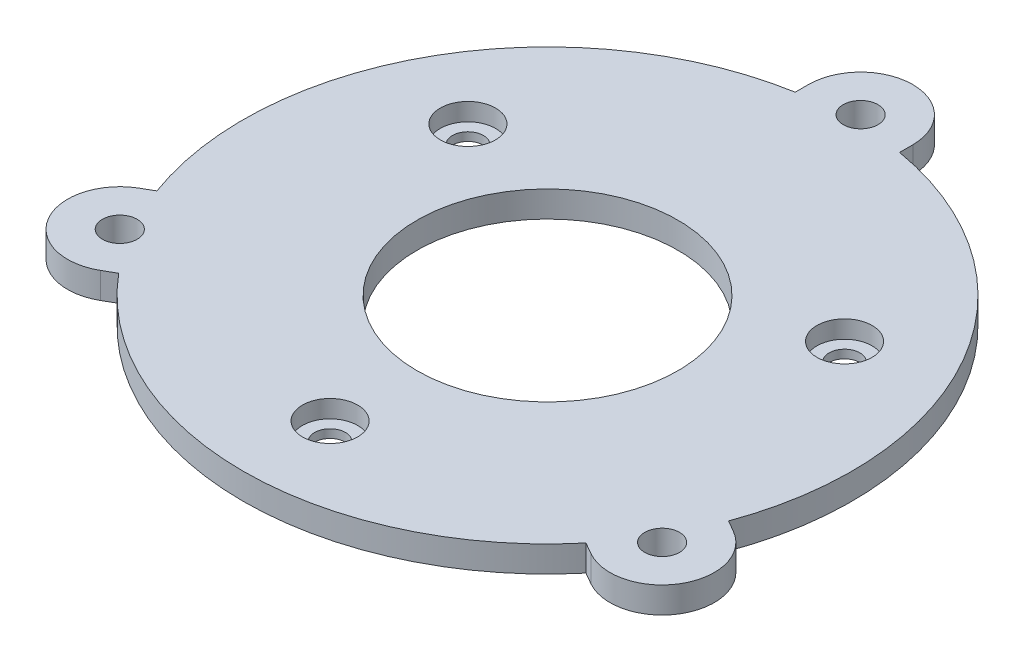
ISO-10303-21;
HEADER;
FILE_DESCRIPTION(('STEP AP214'),'2;1');
FILE_NAME('part.step','',(''),(''),'','','');
FILE_SCHEMA(('AUTOMOTIVE_DESIGN { 1 0 10303 214 1 1 1 1 }'));
ENDSEC;
DATA;
#1=APPLICATION_CONTEXT('core data for automotive mechanical design processes');
#2=APPLICATION_PROTOCOL_DEFINITION('international standard','automotive_design',2000,#1);
#3=PRODUCT_CONTEXT('',#1,'mechanical');
#4=PRODUCT('Part','Part','',(#3));
#5=PRODUCT_RELATED_PRODUCT_CATEGORY('part','',(#4));
#6=PRODUCT_DEFINITION_FORMATION('','',#4);
#7=PRODUCT_DEFINITION_CONTEXT('part definition',#1,'design');
#8=PRODUCT_DEFINITION('design','',#6,#7);
#9=PRODUCT_DEFINITION_SHAPE('','',#8);
#10=(LENGTH_UNIT() NAMED_UNIT(*) SI_UNIT(.MILLI.,.METRE.));
#11=(NAMED_UNIT(*) PLANE_ANGLE_UNIT() SI_UNIT($,.RADIAN.));
#12=(NAMED_UNIT(*) SI_UNIT($,.STERADIAN.) SOLID_ANGLE_UNIT());
#13=UNCERTAINTY_MEASURE_WITH_UNIT(LENGTH_MEASURE(1.E-05),#10,'distance_accuracy_value','');
#14=(GEOMETRIC_REPRESENTATION_CONTEXT(3) GLOBAL_UNCERTAINTY_ASSIGNED_CONTEXT((#13)) GLOBAL_UNIT_ASSIGNED_CONTEXT((#10,
#11,#12)) REPRESENTATION_CONTEXT('',''));
#15=CARTESIAN_POINT('',(0.,0.,0.));
#16=DIRECTION('',(0.,0.,1.));
#17=DIRECTION('',(1.,0.,0.));
#18=AXIS2_PLACEMENT_3D('',#15,#16,#17);
#19=CARTESIAN_POINT('',(1.50000000000001,1.5,-2.59807621135331));
#20=DIRECTION('',(0.500000000000004,0.,-0.866025403784436));
#21=DIRECTION('',(-0.866025403784436,0.,-0.500000000000004));
#22=AXIS2_PLACEMENT_3D('',#19,#20,#21);
#23=PLANE('',#22);
#24=DIRECTION('',(0.866025403784436,0.,0.500000000000004));
#25=VECTOR('',#24,1.);
#26=CARTESIAN_POINT('',(1.50000000000001,0.,-2.59807621135331));
#27=LINE('',#26,#25);
#28=CARTESIAN_POINT('',(16.4310917216391,0.,6.0223936134301));
#29=VERTEX_POINT('',#28);
#30=CARTESIAN_POINT('',(17.0884572681199,0.,6.40192378864676));
#31=VERTEX_POINT('',#30);
#32=EDGE_CURVE('E164',#29,#31,#27,.T.);
#33=ORIENTED_EDGE('',*,*,#32,.F.);
#34=DIRECTION('',(0.,-1.,0.));
#35=VECTOR('',#34,1.);
#36=CARTESIAN_POINT('',(16.4310917216391,1.5,6.0223936134301));
#37=LINE('',#36,#35);
#38=CARTESIAN_POINT('',(16.4310917216391,1.5,6.0223936134301));
#39=VERTEX_POINT('',#38);
#40=EDGE_CURVE('E11',#39,#29,#37,.T.);
#41=ORIENTED_EDGE('',*,*,#40,.F.);
#42=DIRECTION('',(0.866025403784436,0.,0.500000000000004));
#43=VECTOR('',#42,1.);
#44=CARTESIAN_POINT('',(1.50000000000001,1.5,-2.59807621135331));
#45=LINE('',#44,#43);
#46=CARTESIAN_POINT('',(17.0884572681199,1.5,6.40192378864676));
#47=VERTEX_POINT('',#46);
#48=EDGE_CURVE('E204',#39,#47,#45,.T.);
#49=ORIENTED_EDGE('',*,*,#48,.T.);
#50=DIRECTION('',(0.,-1.,0.));
#51=VECTOR('',#50,1.);
#52=CARTESIAN_POINT('',(17.0884572681199,1.5,6.40192378864676));
#53=LINE('',#52,#51);
#54=EDGE_CURVE('E98',#47,#31,#53,.T.);
#55=ORIENTED_EDGE('',*,*,#54,.T.);
#56=EDGE_LOOP('',(#33,#41,#49,#55));
#57=FACE_BOUND('',#56,.T.);
#58=ADVANCED_FACE('F35',(#57),#23,.T.);
#59=CARTESIAN_POINT('',(0.,1.5,0.));
#60=DIRECTION('',(0.,-1.,0.));
#61=DIRECTION('',(0.,0.,-1.));
#62=AXIS2_PLACEMENT_3D('',#59,#60,#61);
#63=CYLINDRICAL_SURFACE('',#62,17.5);
#64=CARTESIAN_POINT('',(0.,0.,0.));
#65=DIRECTION('',(0.,1.,0.));
#66=DIRECTION('',(0.,0.,1.));
#67=AXIS2_PLACEMENT_3D('',#64,#65,#66);
#68=CIRCLE('',#67,17.5);
#69=CARTESIAN_POINT('',(3.,0.,-17.2409396495667));
#70=VERTEX_POINT('',#69);
#71=EDGE_CURVE('E167',#29,#70,#68,.T.);
#72=ORIENTED_EDGE('',*,*,#71,.T.);
#73=DIRECTION('',(0.,-1.,0.));
#74=VECTOR('',#73,1.);
#75=CARTESIAN_POINT('',(3.,1.5,-17.2409396495667));
#76=LINE('',#75,#74);
#77=CARTESIAN_POINT('',(3.,1.5,-17.2409396495667));
#78=VERTEX_POINT('',#77);
#79=EDGE_CURVE('E43',#78,#70,#76,.T.);
#80=ORIENTED_EDGE('',*,*,#79,.F.);
#81=CARTESIAN_POINT('',(0.,1.5,0.));
#82=DIRECTION('',(0.,1.,0.));
#83=DIRECTION('',(0.,0.,1.));
#84=AXIS2_PLACEMENT_3D('',#81,#82,#83);
#85=CIRCLE('',#84,17.5);
#86=EDGE_CURVE('E249',#39,#78,#85,.T.);
#87=ORIENTED_EDGE('',*,*,#86,.F.);
#88=ORIENTED_EDGE('',*,*,#40,.T.);
#89=EDGE_LOOP('',(#72,#80,#87,#88));
#90=FACE_BOUND('',#89,.T.);
#91=ADVANCED_FACE('F331',(#90),#63,.T.);
#92=CARTESIAN_POINT('',(3.,1.5,0.));
#93=DIRECTION('',(-1.,0.,0.));
#94=DIRECTION('',(0.,0.,1.));
#95=AXIS2_PLACEMENT_3D('',#92,#93,#94);
#96=PLANE('',#95);
#97=DIRECTION('',(0.,0.,-1.));
#98=VECTOR('',#97,1.);
#99=CARTESIAN_POINT('',(3.,0.,0.));
#100=LINE('',#99,#98);
#101=CARTESIAN_POINT('',(3.,0.,-18.));
#102=VERTEX_POINT('',#101);
#103=EDGE_CURVE('E170',#70,#102,#100,.T.);
#104=ORIENTED_EDGE('',*,*,#103,.T.);
#105=DIRECTION('',(0.,-1.,0.));
#106=VECTOR('',#105,1.);
#107=CARTESIAN_POINT('',(3.,1.5,-18.));
#108=LINE('',#107,#106);
#109=CARTESIAN_POINT('',(3.,1.5,-18.));
#110=VERTEX_POINT('',#109);
#111=EDGE_CURVE('E220',#110,#102,#108,.T.);
#112=ORIENTED_EDGE('',*,*,#111,.F.);
#113=DIRECTION('',(0.,0.,-1.));
#114=VECTOR('',#113,1.);
#115=CARTESIAN_POINT('',(3.,1.5,0.));
#116=LINE('',#115,#114);
#117=EDGE_CURVE('E229',#78,#110,#116,.T.);
#118=ORIENTED_EDGE('',*,*,#117,.F.);
#119=ORIENTED_EDGE('',*,*,#79,.T.);
#120=EDGE_LOOP('',(#104,#112,#118,#119));
#121=FACE_BOUND('',#120,.T.);
#122=ADVANCED_FACE('F227',(#121),#96,.F.);
#123=CARTESIAN_POINT('',(0.,1.5,-18.));
#124=DIRECTION('',(0.,-1.,0.));
#125=DIRECTION('',(0.,0.,-1.));
#126=AXIS2_PLACEMENT_3D('',#123,#124,#125);
#127=CYLINDRICAL_SURFACE('',#126,3.);
#128=CARTESIAN_POINT('',(0.,0.,-18.));
#129=DIRECTION('',(0.,1.,0.));
#130=DIRECTION('',(0.,0.,1.));
#131=AXIS2_PLACEMENT_3D('',#128,#129,#130);
#132=CIRCLE('',#131,3.);
#133=CARTESIAN_POINT('',(-3.,0.,-18.));
#134=VERTEX_POINT('',#133);
#135=EDGE_CURVE('E172',#102,#134,#132,.T.);
#136=ORIENTED_EDGE('',*,*,#135,.T.);
#137=DIRECTION('',(0.,-1.,0.));
#138=VECTOR('',#137,1.);
#139=CARTESIAN_POINT('',(-3.,1.5,-18.));
#140=LINE('',#139,#138);
#141=CARTESIAN_POINT('',(-3.,1.5,-18.));
#142=VERTEX_POINT('',#141);
#143=EDGE_CURVE('E218',#142,#134,#140,.T.);
#144=ORIENTED_EDGE('',*,*,#143,.F.);
#145=CARTESIAN_POINT('',(0.,1.5,-18.));
#146=DIRECTION('',(0.,1.,0.));
#147=DIRECTION('',(0.,0.,1.));
#148=AXIS2_PLACEMENT_3D('',#145,#146,#147);
#149=CIRCLE('',#148,3.);
#150=EDGE_CURVE('E243',#110,#142,#149,.T.);
#151=ORIENTED_EDGE('',*,*,#150,.F.);
#152=ORIENTED_EDGE('',*,*,#111,.T.);
#153=EDGE_LOOP('',(#136,#144,#151,#152));
#154=FACE_BOUND('',#153,.T.);
#155=ADVANCED_FACE('F240',(#154),#127,.T.);
#156=CARTESIAN_POINT('',(-3.,1.5,0.));
#157=DIRECTION('',(-1.,0.,0.));
#158=DIRECTION('',(0.,0.,1.));
#159=AXIS2_PLACEMENT_3D('',#156,#157,#158);
#160=PLANE('',#159);
#161=DIRECTION('',(0.,0.,-1.));
#162=VECTOR('',#161,1.);
#163=CARTESIAN_POINT('',(-3.,0.,0.));
#164=LINE('',#163,#162);
#165=CARTESIAN_POINT('',(-3.,0.,-17.2409396495667));
#166=VERTEX_POINT('',#165);
#167=EDGE_CURVE('E175',#166,#134,#164,.T.);
#168=ORIENTED_EDGE('',*,*,#167,.F.);
#169=DIRECTION('',(0.,-1.,0.));
#170=VECTOR('',#169,1.);
#171=CARTESIAN_POINT('',(-3.,1.5,-17.2409396495667));
#172=LINE('',#171,#170);
#173=CARTESIAN_POINT('',(-3.,1.5,-17.2409396495667));
#174=VERTEX_POINT('',#173);
#175=EDGE_CURVE('E216',#174,#166,#172,.T.);
#176=ORIENTED_EDGE('',*,*,#175,.F.);
#177=DIRECTION('',(0.,0.,-1.));
#178=VECTOR('',#177,1.);
#179=CARTESIAN_POINT('',(-3.,1.5,0.));
#180=LINE('',#179,#178);
#181=EDGE_CURVE('E245',#174,#142,#180,.T.);
#182=ORIENTED_EDGE('',*,*,#181,.T.);
#183=ORIENTED_EDGE('',*,*,#143,.T.);
#184=EDGE_LOOP('',(#168,#176,#182,#183));
#185=FACE_BOUND('',#184,.T.);
#186=ADVANCED_FACE('F342',(#185),#160,.T.);
#187=CARTESIAN_POINT('',(0.,1.5,0.));
#188=DIRECTION('',(0.,-1.,0.));
#189=DIRECTION('',(0.,0.,-1.));
#190=AXIS2_PLACEMENT_3D('',#187,#188,#189);
#191=CYLINDRICAL_SURFACE('',#190,17.5);
#192=CARTESIAN_POINT('',(0.,0.,0.));
#193=DIRECTION('',(0.,1.,0.));
#194=DIRECTION('',(0.,0.,1.));
#195=AXIS2_PLACEMENT_3D('',#192,#193,#194);
#196=CIRCLE('',#195,17.5);
#197=CARTESIAN_POINT('',(-16.4310917216392,0.,6.02239361342987));
#198=VERTEX_POINT('',#197);
#199=EDGE_CURVE('E178',#166,#198,#196,.T.);
#200=ORIENTED_EDGE('',*,*,#199,.T.);
#201=DIRECTION('',(0.,-1.,0.));
#202=VECTOR('',#201,1.);
#203=CARTESIAN_POINT('',(-16.4310917216392,1.5,6.02239361342987));
#204=LINE('',#203,#202);
#205=CARTESIAN_POINT('',(-16.4310917216392,1.5,6.02239361342987));
#206=VERTEX_POINT('',#205);
#207=EDGE_CURVE('E213',#206,#198,#204,.T.);
#208=ORIENTED_EDGE('',*,*,#207,.F.);
#209=CARTESIAN_POINT('',(0.,1.5,0.));
#210=DIRECTION('',(0.,1.,0.));
#211=DIRECTION('',(0.,0.,1.));
#212=AXIS2_PLACEMENT_3D('',#209,#210,#211);
#213=CIRCLE('',#212,17.5);
#214=EDGE_CURVE('E247',#174,#206,#213,.T.);
#215=ORIENTED_EDGE('',*,*,#214,.F.);
#216=ORIENTED_EDGE('',*,*,#175,.T.);
#217=EDGE_LOOP('',(#200,#208,#215,#216));
#218=FACE_BOUND('',#217,.T.);
#219=ADVANCED_FACE('F345',(#218),#191,.T.);
#220=CARTESIAN_POINT('',(-1.49999999999998,1.5,-2.59807621135333));
#221=DIRECTION('',(0.499999999999992,0.,0.866025403784443));
#222=DIRECTION('',(0.866025403784443,0.,-0.499999999999992));
#223=AXIS2_PLACEMENT_3D('',#220,#221,#222);
#224=PLANE('',#223);
#225=DIRECTION('',(-0.866025403784443,0.,0.499999999999992));
#226=VECTOR('',#225,1.);
#227=CARTESIAN_POINT('',(-1.49999999999998,0.,-2.59807621135333));
#228=LINE('',#227,#226);
#229=CARTESIAN_POINT('',(-17.08845726812,0.,6.40192378864653));
#230=VERTEX_POINT('',#229);
#231=EDGE_CURVE('E180',#198,#230,#228,.T.);
#232=ORIENTED_EDGE('',*,*,#231,.T.);
#233=DIRECTION('',(0.,-1.,0.));
#234=VECTOR('',#233,1.);
#235=CARTESIAN_POINT('',(-17.08845726812,1.5,6.40192378864653));
#236=LINE('',#235,#234);
#237=CARTESIAN_POINT('',(-17.08845726812,1.5,6.40192378864653));
#238=VERTEX_POINT('',#237);
#239=EDGE_CURVE('E210',#238,#230,#236,.T.);
#240=ORIENTED_EDGE('',*,*,#239,.F.);
#241=DIRECTION('',(-0.866025403784443,0.,0.499999999999992));
#242=VECTOR('',#241,1.);
#243=CARTESIAN_POINT('',(-1.49999999999998,1.5,-2.59807621135333));
#244=LINE('',#243,#242);
#245=EDGE_CURVE('E254',#206,#238,#244,.T.);
#246=ORIENTED_EDGE('',*,*,#245,.F.);
#247=ORIENTED_EDGE('',*,*,#207,.T.);
#248=EDGE_LOOP('',(#232,#240,#246,#247));
#249=FACE_BOUND('',#248,.T.);
#250=ADVANCED_FACE('F349',(#249),#224,.F.);
#251=CARTESIAN_POINT('',(-15.58845726812,1.5,8.99999999999986));
#252=DIRECTION('',(0.,-1.,0.));
#253=DIRECTION('',(0.,0.,-1.));
#254=AXIS2_PLACEMENT_3D('',#251,#252,#253);
#255=CYLINDRICAL_SURFACE('',#254,3.);
#256=CARTESIAN_POINT('',(-15.58845726812,0.,8.99999999999986));
#257=DIRECTION('',(0.,1.,0.));
#258=DIRECTION('',(0.,0.,1.));
#259=AXIS2_PLACEMENT_3D('',#256,#257,#258);
#260=CIRCLE('',#259,3.);
#261=CARTESIAN_POINT('',(-14.08845726812,0.,11.5980762113532));
#262=VERTEX_POINT('',#261);
#263=EDGE_CURVE('E182',#230,#262,#260,.T.);
#264=ORIENTED_EDGE('',*,*,#263,.T.);
#265=DIRECTION('',(0.,-1.,0.));
#266=VECTOR('',#265,1.);
#267=CARTESIAN_POINT('',(-14.08845726812,1.5,11.5980762113532));
#268=LINE('',#267,#266);
#269=CARTESIAN_POINT('',(-14.08845726812,1.5,11.5980762113532));
#270=VERTEX_POINT('',#269);
#271=EDGE_CURVE('E208',#270,#262,#268,.T.);
#272=ORIENTED_EDGE('',*,*,#271,.F.);
#273=CARTESIAN_POINT('',(-15.58845726812,1.5,8.99999999999986));
#274=DIRECTION('',(0.,1.,0.));
#275=DIRECTION('',(0.,0.,1.));
#276=AXIS2_PLACEMENT_3D('',#273,#274,#275);
#277=CIRCLE('',#276,3.);
#278=EDGE_CURVE('E256',#238,#270,#277,.T.);
#279=ORIENTED_EDGE('',*,*,#278,.F.);
#280=ORIENTED_EDGE('',*,*,#239,.T.);
#281=EDGE_LOOP('',(#264,#272,#279,#280));
#282=FACE_BOUND('',#281,.T.);
#283=ADVANCED_FACE('F353',(#282),#255,.T.);
#284=CARTESIAN_POINT('',(1.49999999999998,1.5,2.59807621135333));
#285=DIRECTION('',(0.499999999999992,0.,0.866025403784443));
#286=DIRECTION('',(0.866025403784443,0.,-0.499999999999992));
#287=AXIS2_PLACEMENT_3D('',#284,#285,#286);
#288=PLANE('',#287);
#289=DIRECTION('',(-0.866025403784443,0.,0.499999999999992));
#290=VECTOR('',#289,1.);
#291=CARTESIAN_POINT('',(1.49999999999998,0.,2.59807621135333));
#292=LINE('',#291,#290);
#293=CARTESIAN_POINT('',(-13.4310917216392,0.,11.2185460361365));
#294=VERTEX_POINT('',#293);
#295=EDGE_CURVE('E185',#294,#262,#292,.T.);
#296=ORIENTED_EDGE('',*,*,#295,.F.);
#297=DIRECTION('',(0.,-1.,0.));
#298=VECTOR('',#297,1.);
#299=CARTESIAN_POINT('',(-13.4310917216392,1.5,11.2185460361365));
#300=LINE('',#299,#298);
#301=CARTESIAN_POINT('',(-13.4310917216392,1.5,11.2185460361365));
#302=VERTEX_POINT('',#301);
#303=EDGE_CURVE('E144',#302,#294,#300,.T.);
#304=ORIENTED_EDGE('',*,*,#303,.F.);
#305=DIRECTION('',(-0.866025403784443,0.,0.499999999999992));
#306=VECTOR('',#305,1.);
#307=CARTESIAN_POINT('',(1.49999999999998,1.5,2.59807621135333));
#308=LINE('',#307,#306);
#309=EDGE_CURVE('E137',#302,#270,#308,.T.);
#310=ORIENTED_EDGE('',*,*,#309,.T.);
#311=ORIENTED_EDGE('',*,*,#271,.T.);
#312=EDGE_LOOP('',(#296,#304,#310,#311));
#313=FACE_BOUND('',#312,.T.);
#314=ADVANCED_FACE('F259',(#313),#288,.T.);
#315=CARTESIAN_POINT('',(0.,1.5,0.));
#316=DIRECTION('',(0.,-1.,0.));
#317=DIRECTION('',(0.,0.,-1.));
#318=AXIS2_PLACEMENT_3D('',#315,#316,#317);
#319=CYLINDRICAL_SURFACE('',#318,17.5);
#320=CARTESIAN_POINT('',(0.,0.,0.));
#321=DIRECTION('',(0.,1.,0.));
#322=DIRECTION('',(0.,0.,1.));
#323=AXIS2_PLACEMENT_3D('',#320,#321,#322);
#324=CIRCLE('',#323,17.5);
#325=CARTESIAN_POINT('',(13.4310917216391,0.,11.2185460361367));
#326=VERTEX_POINT('',#325);
#327=EDGE_CURVE('E143',#294,#326,#324,.T.);
#328=ORIENTED_EDGE('',*,*,#327,.T.);
#329=DIRECTION('',(0.,-1.,0.));
#330=VECTOR('',#329,1.);
#331=CARTESIAN_POINT('',(13.4310917216391,1.5,11.2185460361367));
#332=LINE('',#331,#330);
#333=CARTESIAN_POINT('',(13.4310917216391,1.5,11.2185460361367));
#334=VERTEX_POINT('',#333);
#335=EDGE_CURVE('E140',#334,#326,#332,.T.);
#336=ORIENTED_EDGE('',*,*,#335,.F.);
#337=CARTESIAN_POINT('',(0.,1.5,0.));
#338=DIRECTION('',(0.,1.,0.));
#339=DIRECTION('',(0.,0.,1.));
#340=AXIS2_PLACEMENT_3D('',#337,#338,#339);
#341=CIRCLE('',#340,17.5);
#342=EDGE_CURVE('E130',#302,#334,#341,.T.);
#343=ORIENTED_EDGE('',*,*,#342,.F.);
#344=ORIENTED_EDGE('',*,*,#303,.T.);
#345=EDGE_LOOP('',(#328,#336,#343,#344));
#346=FACE_BOUND('',#345,.T.);
#347=ADVANCED_FACE('F141',(#346),#319,.T.);
#348=CARTESIAN_POINT('',(-1.50000000000001,1.5,2.59807621135331));
#349=DIRECTION('',(0.500000000000004,0.,-0.866025403784436));
#350=DIRECTION('',(-0.866025403784436,0.,-0.500000000000004));
#351=AXIS2_PLACEMENT_3D('',#348,#349,#350);
#352=PLANE('',#351);
#353=DIRECTION('',(0.866025403784436,0.,0.500000000000004));
#354=VECTOR('',#353,1.);
#355=CARTESIAN_POINT('',(-1.50000000000001,0.,2.59807621135331));
#356=LINE('',#355,#354);
#357=CARTESIAN_POINT('',(14.0884572681198,0.,11.5980762113534));
#358=VERTEX_POINT('',#357);
#359=EDGE_CURVE('E91',#326,#358,#356,.T.);
#360=ORIENTED_EDGE('',*,*,#359,.T.);
#361=DIRECTION('',(0.,-1.,0.));
#362=VECTOR('',#361,1.);
#363=CARTESIAN_POINT('',(14.0884572681198,1.5,11.5980762113534));
#364=LINE('',#363,#362);
#365=CARTESIAN_POINT('',(14.0884572681198,1.5,11.5980762113534));
#366=VERTEX_POINT('',#365);
#367=EDGE_CURVE('E145',#366,#358,#364,.T.);
#368=ORIENTED_EDGE('',*,*,#367,.F.);
#369=DIRECTION('',(0.866025403784436,0.,0.500000000000004));
#370=VECTOR('',#369,1.);
#371=CARTESIAN_POINT('',(-1.50000000000001,1.5,2.59807621135331));
#372=LINE('',#371,#370);
#373=EDGE_CURVE('E135',#334,#366,#372,.T.);
#374=ORIENTED_EDGE('',*,*,#373,.F.);
#375=ORIENTED_EDGE('',*,*,#335,.T.);
#376=EDGE_LOOP('',(#360,#368,#374,#375));
#377=FACE_BOUND('',#376,.T.);
#378=ADVANCED_FACE('F147',(#377),#352,.F.);
#379=CARTESIAN_POINT('',(-15.58845726812,1.5,8.99999999999986));
#380=DIRECTION('',(0.,-1.,0.));
#381=DIRECTION('',(0.,0.,-1.));
#382=AXIS2_PLACEMENT_3D('',#379,#380,#381);
#383=CYLINDRICAL_SURFACE('',#382,1.);
#384=CARTESIAN_POINT('',(-15.58845726812,1.5,8.99999999999986));
#385=DIRECTION('',(0.,1.,0.));
#386=DIRECTION('',(0.,0.,1.));
#387=AXIS2_PLACEMENT_3D('',#384,#385,#386);
#388=CIRCLE('',#387,1.);
#389=CARTESIAN_POINT('',(-15.58845726812,1.5,9.99999999999986));
#390=VERTEX_POINT('',#389);
#391=EDGE_CURVE('E158',#390,#390,#388,.T.);
#392=ORIENTED_EDGE('',*,*,#391,.T.);
#393=EDGE_LOOP('',(#392));
#394=FACE_BOUND('',#393,.T.);
#395=CARTESIAN_POINT('',(-15.58845726812,0.,8.99999999999986));
#396=DIRECTION('',(0.,1.,0.));
#397=DIRECTION('',(0.,0.,1.));
#398=AXIS2_PLACEMENT_3D('',#395,#396,#397);
#399=CIRCLE('',#398,1.);
#400=CARTESIAN_POINT('',(-15.58845726812,0.,9.99999999999986));
#401=VERTEX_POINT('',#400);
#402=EDGE_CURVE('E198',#401,#401,#399,.T.);
#403=ORIENTED_EDGE('',*,*,#402,.F.);
#404=EDGE_LOOP('',(#403));
#405=FACE_BOUND('',#404,.T.);
#406=ADVANCED_FACE('F364',(#394,#405),#383,.F.);
#407=CARTESIAN_POINT('',(0.,1.5,0.));
#408=DIRECTION('',(0.,-1.,0.));
#409=DIRECTION('',(0.,0.,-1.));
#410=AXIS2_PLACEMENT_3D('',#407,#408,#409);
#411=CYLINDRICAL_SURFACE('',#410,7.5);
#412=CARTESIAN_POINT('',(0.,1.5,0.));
#413=DIRECTION('',(0.,1.,0.));
#414=DIRECTION('',(0.,0.,1.));
#415=AXIS2_PLACEMENT_3D('',#412,#413,#414);
#416=CIRCLE('',#415,7.5);
#417=CARTESIAN_POINT('',(0.,1.5,7.5));
#418=VERTEX_POINT('',#417);
#419=EDGE_CURVE('E155',#418,#418,#416,.T.);
#420=ORIENTED_EDGE('',*,*,#419,.T.);
#421=EDGE_LOOP('',(#420));
#422=FACE_BOUND('',#421,.T.);
#423=CARTESIAN_POINT('',(0.,0.,0.));
#424=DIRECTION('',(0.,1.,0.));
#425=DIRECTION('',(0.,0.,1.));
#426=AXIS2_PLACEMENT_3D('',#423,#424,#425);
#427=CIRCLE('',#426,7.5);
#428=CARTESIAN_POINT('',(0.,0.,7.5));
#429=VERTEX_POINT('',#428);
#430=EDGE_CURVE('E195',#429,#429,#427,.T.);
#431=ORIENTED_EDGE('',*,*,#430,.F.);
#432=EDGE_LOOP('',(#431));
#433=FACE_BOUND('',#432,.T.);
#434=ADVANCED_FACE('F370',(#422,#433),#411,.F.);
#435=CARTESIAN_POINT('',(15.5884572681199,1.5,9.00000000000008));
#436=DIRECTION('',(0.,-1.,0.));
#437=DIRECTION('',(0.,0.,-1.));
#438=AXIS2_PLACEMENT_3D('',#435,#436,#437);
#439=CYLINDRICAL_SURFACE('',#438,0.999999999999999);
#440=CARTESIAN_POINT('',(15.5884572681199,1.5,9.00000000000008));
#441=DIRECTION('',(0.,1.,0.));
#442=DIRECTION('',(0.,0.,1.));
#443=AXIS2_PLACEMENT_3D('',#440,#441,#442);
#444=CIRCLE('',#443,0.999999999999999);
#445=CARTESIAN_POINT('',(15.5884572681199,1.5,10.0000000000001));
#446=VERTEX_POINT('',#445);
#447=EDGE_CURVE('E149',#446,#446,#444,.T.);
#448=ORIENTED_EDGE('',*,*,#447,.T.);
#449=EDGE_LOOP('',(#448));
#450=FACE_BOUND('',#449,.T.);
#451=CARTESIAN_POINT('',(15.5884572681199,0.,9.00000000000008));
#452=DIRECTION('',(0.,1.,0.));
#453=DIRECTION('',(0.,0.,1.));
#454=AXIS2_PLACEMENT_3D('',#451,#452,#453);
#455=CIRCLE('',#454,0.999999999999999);
#456=CARTESIAN_POINT('',(15.5884572681199,0.,10.0000000000001));
#457=VERTEX_POINT('',#456);
#458=EDGE_CURVE('E192',#457,#457,#455,.T.);
#459=ORIENTED_EDGE('',*,*,#458,.F.);
#460=EDGE_LOOP('',(#459));
#461=FACE_BOUND('',#460,.T.);
#462=ADVANCED_FACE('F367',(#450,#461),#439,.F.);
#463=CARTESIAN_POINT('',(15.5884572681199,1.5,9.00000000000008));
#464=DIRECTION('',(0.,-1.,0.));
#465=DIRECTION('',(0.,0.,-1.));
#466=AXIS2_PLACEMENT_3D('',#463,#464,#465);
#467=CYLINDRICAL_SURFACE('',#466,3.);
#468=CARTESIAN_POINT('',(15.5884572681199,0.,9.00000000000008));
#469=DIRECTION('',(0.,1.,0.));
#470=DIRECTION('',(0.,0.,1.));
#471=AXIS2_PLACEMENT_3D('',#468,#469,#470);
#472=CIRCLE('',#471,3.);
#473=EDGE_CURVE('E190',#358,#31,#472,.T.);
#474=ORIENTED_EDGE('',*,*,#473,.T.);
#475=ORIENTED_EDGE('',*,*,#54,.F.);
#476=CARTESIAN_POINT('',(15.5884572681199,1.5,9.00000000000008));
#477=DIRECTION('',(0.,1.,0.));
#478=DIRECTION('',(0.,0.,1.));
#479=AXIS2_PLACEMENT_3D('',#476,#477,#478);
#480=CIRCLE('',#479,3.);
#481=EDGE_CURVE('E51',#366,#47,#480,.T.);
#482=ORIENTED_EDGE('',*,*,#481,.F.);
#483=ORIENTED_EDGE('',*,*,#367,.T.);
#484=EDGE_LOOP('',(#474,#475,#482,#483));
#485=FACE_BOUND('',#484,.T.);
#486=ADVANCED_FACE('F264',(#485),#467,.T.);
#487=CARTESIAN_POINT('',(0.,1.5,-18.));
#488=DIRECTION('',(0.,-1.,0.));
#489=DIRECTION('',(0.,0.,-1.));
#490=AXIS2_PLACEMENT_3D('',#487,#488,#489);
#491=CYLINDRICAL_SURFACE('',#490,1.);
#492=CARTESIAN_POINT('',(0.,1.5,-18.));
#493=DIRECTION('',(0.,1.,0.));
#494=DIRECTION('',(0.,0.,1.));
#495=AXIS2_PLACEMENT_3D('',#492,#493,#494);
#496=CIRCLE('',#495,1.);
#497=CARTESIAN_POINT('',(0.,1.5,-17.));
#498=VERTEX_POINT('',#497);
#499=EDGE_CURVE('E161',#498,#498,#496,.T.);
#500=ORIENTED_EDGE('',*,*,#499,.T.);
#501=EDGE_LOOP('',(#500));
#502=FACE_BOUND('',#501,.T.);
#503=CARTESIAN_POINT('',(0.,0.,-18.));
#504=DIRECTION('',(0.,1.,0.));
#505=DIRECTION('',(0.,0.,1.));
#506=AXIS2_PLACEMENT_3D('',#503,#504,#505);
#507=CIRCLE('',#506,1.);
#508=CARTESIAN_POINT('',(0.,0.,-17.));
#509=VERTEX_POINT('',#508);
#510=EDGE_CURVE('E201',#509,#509,#507,.T.);
#511=ORIENTED_EDGE('',*,*,#510,.F.);
#512=EDGE_LOOP('',(#511));
#513=FACE_BOUND('',#512,.T.);
#514=ADVANCED_FACE('F307',(#502,#513),#491,.F.);
#515=CARTESIAN_POINT('',(0.,1.5,0.));
#516=DIRECTION('',(0.,1.,0.));
#517=DIRECTION('',(0.,0.,1.));
#518=AXIS2_PLACEMENT_3D('',#515,#516,#517);
#519=PLANE('',#518);
#520=CARTESIAN_POINT('',(-10.8253175473055,1.5,-6.25000000000005));
#521=DIRECTION('',(0.,1.,0.));
#522=DIRECTION('',(0.,0.,1.));
#523=AXIS2_PLACEMENT_3D('',#520,#521,#522);
#524=CIRCLE('',#523,1.5875);
#525=CARTESIAN_POINT('',(-10.8253175473055,1.5,-4.66250000000005));
#526=VERTEX_POINT('',#525);
#527=EDGE_CURVE('E299',#526,#526,#524,.T.);
#528=ORIENTED_EDGE('',*,*,#527,.F.);
#529=EDGE_LOOP('',(#528));
#530=FACE_BOUND('',#529,.T.);
#531=CARTESIAN_POINT('',(10.8253175473055,1.5,-6.2499999999999));
#532=DIRECTION('',(0.,1.,0.));
#533=DIRECTION('',(0.,0.,1.));
#534=AXIS2_PLACEMENT_3D('',#531,#532,#533);
#535=CIRCLE('',#534,1.5875);
#536=CARTESIAN_POINT('',(10.8253175473055,1.5,-4.66249999999991));
#537=VERTEX_POINT('',#536);
#538=EDGE_CURVE('E287',#537,#537,#535,.T.);
#539=ORIENTED_EDGE('',*,*,#538,.F.);
#540=EDGE_LOOP('',(#539));
#541=FACE_BOUND('',#540,.T.);
#542=CARTESIAN_POINT('',(0.,1.5,12.5));
#543=DIRECTION('',(0.,1.,0.));
#544=DIRECTION('',(0.,0.,1.));
#545=AXIS2_PLACEMENT_3D('',#542,#543,#544);
#546=CIRCLE('',#545,1.5875);
#547=CARTESIAN_POINT('',(0.,1.5,14.0875));
#548=VERTEX_POINT('',#547);
#549=EDGE_CURVE('E275',#548,#548,#546,.T.);
#550=ORIENTED_EDGE('',*,*,#549,.F.);
#551=EDGE_LOOP('',(#550));
#552=FACE_BOUND('',#551,.T.);
#553=ORIENTED_EDGE('',*,*,#48,.F.);
#554=ORIENTED_EDGE('',*,*,#86,.T.);
#555=ORIENTED_EDGE('',*,*,#117,.T.);
#556=ORIENTED_EDGE('',*,*,#150,.T.);
#557=ORIENTED_EDGE('',*,*,#181,.F.);
#558=ORIENTED_EDGE('',*,*,#214,.T.);
#559=ORIENTED_EDGE('',*,*,#245,.T.);
#560=ORIENTED_EDGE('',*,*,#278,.T.);
#561=ORIENTED_EDGE('',*,*,#309,.F.);
#562=ORIENTED_EDGE('',*,*,#342,.T.);
#563=ORIENTED_EDGE('',*,*,#373,.T.);
#564=ORIENTED_EDGE('',*,*,#481,.T.);
#565=EDGE_LOOP('',(#553,#554,#555,#556,#557,#558,#559,#560,#561,#562,#563,#564));
#566=FACE_BOUND('',#565,.T.);
#567=ORIENTED_EDGE('',*,*,#447,.F.);
#568=EDGE_LOOP('',(#567));
#569=FACE_BOUND('',#568,.T.);
#570=ORIENTED_EDGE('',*,*,#419,.F.);
#571=EDGE_LOOP('',(#570));
#572=FACE_BOUND('',#571,.T.);
#573=ORIENTED_EDGE('',*,*,#391,.F.);
#574=EDGE_LOOP('',(#573));
#575=FACE_BOUND('',#574,.T.);
#576=ORIENTED_EDGE('',*,*,#499,.F.);
#577=EDGE_LOOP('',(#576));
#578=FACE_BOUND('',#577,.T.);
#579=ADVANCED_FACE('F132',(#530,#541,#552,#566,#569,#572,#575,#578),#519,.T.);
#580=CARTESIAN_POINT('',(0.,0.,0.));
#581=DIRECTION('',(0.,1.,0.));
#582=DIRECTION('',(0.,0.,1.));
#583=AXIS2_PLACEMENT_3D('',#580,#581,#582);
#584=PLANE('',#583);
#585=CARTESIAN_POINT('',(-10.8253175473055,0.,-6.25000000000005));
#586=DIRECTION('',(0.,1.,0.));
#587=DIRECTION('',(0.,0.,1.));
#588=AXIS2_PLACEMENT_3D('',#585,#586,#587);
#589=CIRCLE('',#588,0.889000000000001);
#590=CARTESIAN_POINT('',(-10.8253175473055,0.,-5.36100000000005));
#591=VERTEX_POINT('',#590);
#592=EDGE_CURVE('E290',#591,#591,#589,.T.);
#593=ORIENTED_EDGE('',*,*,#592,.T.);
#594=EDGE_LOOP('',(#593));
#595=FACE_BOUND('',#594,.T.);
#596=CARTESIAN_POINT('',(10.8253175473055,0.,-6.2499999999999));
#597=DIRECTION('',(0.,1.,0.));
#598=DIRECTION('',(0.,0.,1.));
#599=AXIS2_PLACEMENT_3D('',#596,#597,#598);
#600=CIRCLE('',#599,0.889000000000001);
#601=CARTESIAN_POINT('',(10.8253175473055,0.,-5.3609999999999));
#602=VERTEX_POINT('',#601);
#603=EDGE_CURVE('E278',#602,#602,#600,.T.);
#604=ORIENTED_EDGE('',*,*,#603,.T.);
#605=EDGE_LOOP('',(#604));
#606=FACE_BOUND('',#605,.T.);
#607=CARTESIAN_POINT('',(0.,0.,12.5));
#608=DIRECTION('',(0.,1.,0.));
#609=DIRECTION('',(0.,0.,1.));
#610=AXIS2_PLACEMENT_3D('',#607,#608,#609);
#611=CIRCLE('',#610,0.889);
#612=CARTESIAN_POINT('',(0.,0.,13.389));
#613=VERTEX_POINT('',#612);
#614=EDGE_CURVE('E168',#613,#613,#611,.T.);
#615=ORIENTED_EDGE('',*,*,#614,.T.);
#616=EDGE_LOOP('',(#615));
#617=FACE_BOUND('',#616,.T.);
#618=ORIENTED_EDGE('',*,*,#32,.T.);
#619=ORIENTED_EDGE('',*,*,#473,.F.);
#620=ORIENTED_EDGE('',*,*,#359,.F.);
#621=ORIENTED_EDGE('',*,*,#327,.F.);
#622=ORIENTED_EDGE('',*,*,#295,.T.);
#623=ORIENTED_EDGE('',*,*,#263,.F.);
#624=ORIENTED_EDGE('',*,*,#231,.F.);
#625=ORIENTED_EDGE('',*,*,#199,.F.);
#626=ORIENTED_EDGE('',*,*,#167,.T.);
#627=ORIENTED_EDGE('',*,*,#135,.F.);
#628=ORIENTED_EDGE('',*,*,#103,.F.);
#629=ORIENTED_EDGE('',*,*,#71,.F.);
#630=EDGE_LOOP('',(#618,#619,#620,#621,#622,#623,#624,#625,#626,#627,#628,#629));
#631=FACE_BOUND('',#630,.T.);
#632=ORIENTED_EDGE('',*,*,#458,.T.);
#633=EDGE_LOOP('',(#632));
#634=FACE_BOUND('',#633,.T.);
#635=ORIENTED_EDGE('',*,*,#430,.T.);
#636=EDGE_LOOP('',(#635));
#637=FACE_BOUND('',#636,.T.);
#638=ORIENTED_EDGE('',*,*,#402,.T.);
#639=EDGE_LOOP('',(#638));
#640=FACE_BOUND('',#639,.T.);
#641=ORIENTED_EDGE('',*,*,#510,.T.);
#642=EDGE_LOOP('',(#641));
#643=FACE_BOUND('',#642,.T.);
#644=ADVANCED_FACE('F234',(#595,#606,#617,#631,#634,#637,#640,#643),#584,.F.);
#645=CARTESIAN_POINT('',(0.,1.5,12.5));
#646=DIRECTION('',(0.,1.,0.));
#647=DIRECTION('',(0.,0.,1.));
#648=AXIS2_PLACEMENT_3D('',#645,#646,#647);
#649=CYLINDRICAL_SURFACE('',#648,0.889);
#650=ORIENTED_EDGE('',*,*,#614,.F.);
#651=EDGE_LOOP('',(#650));
#652=FACE_BOUND('',#651,.T.);
#653=CARTESIAN_POINT('',(0.,0.484,12.5));
#654=DIRECTION('',(0.,1.,0.));
#655=DIRECTION('',(0.,0.,1.));
#656=AXIS2_PLACEMENT_3D('',#653,#654,#655);
#657=CIRCLE('',#656,0.889);
#658=CARTESIAN_POINT('',(0.,0.484,13.389));
#659=VERTEX_POINT('',#658);
#660=EDGE_CURVE('E269',#659,#659,#657,.T.);
#661=ORIENTED_EDGE('',*,*,#660,.T.);
#662=EDGE_LOOP('',(#661));
#663=FACE_BOUND('',#662,.T.);
#664=ADVANCED_FACE('F326',(#652,#663),#649,.F.);
#665=CARTESIAN_POINT('',(0.889000000000001,0.484,12.5));
#666=DIRECTION('',(0.,-1.,0.));
#667=DIRECTION('',(0.,0.,-1.));
#668=AXIS2_PLACEMENT_3D('',#665,#666,#667);
#669=PLANE('',#668);
#670=ORIENTED_EDGE('',*,*,#660,.F.);
#671=EDGE_LOOP('',(#670));
#672=FACE_BOUND('',#671,.T.);
#673=CARTESIAN_POINT('',(0.,0.484,12.5));
#674=DIRECTION('',(0.,1.,0.));
#675=DIRECTION('',(0.,0.,1.));
#676=AXIS2_PLACEMENT_3D('',#673,#674,#675);
#677=CIRCLE('',#676,1.5875);
#678=CARTESIAN_POINT('',(0.,0.484,14.0875));
#679=VERTEX_POINT('',#678);
#680=EDGE_CURVE('E272',#679,#679,#677,.T.);
#681=ORIENTED_EDGE('',*,*,#680,.T.);
#682=EDGE_LOOP('',(#681));
#683=FACE_BOUND('',#682,.T.);
#684=ADVANCED_FACE('F316',(#672,#683),#669,.F.);
#685=CARTESIAN_POINT('',(0.,1.5,12.5));
#686=DIRECTION('',(0.,1.,0.));
#687=DIRECTION('',(0.,0.,1.));
#688=AXIS2_PLACEMENT_3D('',#685,#686,#687);
#689=CYLINDRICAL_SURFACE('',#688,1.5875);
#690=ORIENTED_EDGE('',*,*,#680,.F.);
#691=EDGE_LOOP('',(#690));
#692=FACE_BOUND('',#691,.T.);
#693=ORIENTED_EDGE('',*,*,#549,.T.);
#694=EDGE_LOOP('',(#693));
#695=FACE_BOUND('',#694,.T.);
#696=ADVANCED_FACE('F313',(#692,#695),#689,.F.);
#697=CARTESIAN_POINT('',(10.8253175473055,1.5,-6.2499999999999));
#698=DIRECTION('',(0.,1.,0.));
#699=DIRECTION('',(0.,0.,1.));
#700=AXIS2_PLACEMENT_3D('',#697,#698,#699);
#701=CYLINDRICAL_SURFACE('',#700,0.889);
#702=ORIENTED_EDGE('',*,*,#603,.F.);
#703=EDGE_LOOP('',(#702));
#704=FACE_BOUND('',#703,.T.);
#705=CARTESIAN_POINT('',(10.8253175473055,0.484,-6.2499999999999));
#706=DIRECTION('',(0.,1.,0.));
#707=DIRECTION('',(0.,0.,1.));
#708=AXIS2_PLACEMENT_3D('',#705,#706,#707);
#709=CIRCLE('',#708,0.888999999999999);
#710=CARTESIAN_POINT('',(10.8253175473055,0.484,-5.3609999999999));
#711=VERTEX_POINT('',#710);
#712=EDGE_CURVE('E281',#711,#711,#709,.T.);
#713=ORIENTED_EDGE('',*,*,#712,.T.);
#714=EDGE_LOOP('',(#713));
#715=FACE_BOUND('',#714,.T.);
#716=ADVANCED_FACE('F315',(#704,#715),#701,.F.);
#717=CARTESIAN_POINT('',(11.7143175473055,0.484,-6.2499999999999));
#718=DIRECTION('',(0.,-1.,0.));
#719=DIRECTION('',(0.,0.,-1.));
#720=AXIS2_PLACEMENT_3D('',#717,#718,#719);
#721=PLANE('',#720);
#722=ORIENTED_EDGE('',*,*,#712,.F.);
#723=EDGE_LOOP('',(#722));
#724=FACE_BOUND('',#723,.T.);
#725=CARTESIAN_POINT('',(10.8253175473055,0.484,-6.2499999999999));
#726=DIRECTION('',(0.,1.,0.));
#727=DIRECTION('',(0.,0.,1.));
#728=AXIS2_PLACEMENT_3D('',#725,#726,#727);
#729=CIRCLE('',#728,1.5875);
#730=CARTESIAN_POINT('',(10.8253175473055,0.484,-4.66249999999991));
#731=VERTEX_POINT('',#730);
#732=EDGE_CURVE('E284',#731,#731,#729,.T.);
#733=ORIENTED_EDGE('',*,*,#732,.T.);
#734=EDGE_LOOP('',(#733));
#735=FACE_BOUND('',#734,.T.);
#736=ADVANCED_FACE('F323',(#724,#735),#721,.F.);
#737=CARTESIAN_POINT('',(10.8253175473055,1.5,-6.2499999999999));
#738=DIRECTION('',(0.,1.,0.));
#739=DIRECTION('',(0.,0.,1.));
#740=AXIS2_PLACEMENT_3D('',#737,#738,#739);
#741=CYLINDRICAL_SURFACE('',#740,1.5875);
#742=ORIENTED_EDGE('',*,*,#732,.F.);
#743=EDGE_LOOP('',(#742));
#744=FACE_BOUND('',#743,.T.);
#745=ORIENTED_EDGE('',*,*,#538,.T.);
#746=EDGE_LOOP('',(#745));
#747=FACE_BOUND('',#746,.T.);
#748=ADVANCED_FACE('F418',(#744,#747),#741,.F.);
#749=CARTESIAN_POINT('',(-10.8253175473055,1.5,-6.25000000000005));
#750=DIRECTION('',(0.,1.,0.));
#751=DIRECTION('',(0.,0.,1.));
#752=AXIS2_PLACEMENT_3D('',#749,#750,#751);
#753=CYLINDRICAL_SURFACE('',#752,0.889);
#754=ORIENTED_EDGE('',*,*,#592,.F.);
#755=EDGE_LOOP('',(#754));
#756=FACE_BOUND('',#755,.T.);
#757=CARTESIAN_POINT('',(-10.8253175473055,0.484,-6.25000000000005));
#758=DIRECTION('',(0.,1.,0.));
#759=DIRECTION('',(0.,0.,1.));
#760=AXIS2_PLACEMENT_3D('',#757,#758,#759);
#761=CIRCLE('',#760,0.888999999999999);
#762=CARTESIAN_POINT('',(-10.8253175473055,0.484,-5.36100000000005));
#763=VERTEX_POINT('',#762);
#764=EDGE_CURVE('E293',#763,#763,#761,.T.);
#765=ORIENTED_EDGE('',*,*,#764,.T.);
#766=EDGE_LOOP('',(#765));
#767=FACE_BOUND('',#766,.T.);
#768=ADVANCED_FACE('F428',(#756,#767),#753,.F.);
#769=CARTESIAN_POINT('',(-9.93631754730546,0.484,-6.25000000000005));
#770=DIRECTION('',(0.,-1.,0.));
#771=DIRECTION('',(0.,0.,-1.));
#772=AXIS2_PLACEMENT_3D('',#769,#770,#771);
#773=PLANE('',#772);
#774=ORIENTED_EDGE('',*,*,#764,.F.);
#775=EDGE_LOOP('',(#774));
#776=FACE_BOUND('',#775,.T.);
#777=CARTESIAN_POINT('',(-10.8253175473055,0.484,-6.25000000000005));
#778=DIRECTION('',(0.,1.,0.));
#779=DIRECTION('',(0.,0.,1.));
#780=AXIS2_PLACEMENT_3D('',#777,#778,#779);
#781=CIRCLE('',#780,1.5875);
#782=CARTESIAN_POINT('',(-10.8253175473055,0.484,-4.66250000000005));
#783=VERTEX_POINT('',#782);
#784=EDGE_CURVE('E296',#783,#783,#781,.T.);
#785=ORIENTED_EDGE('',*,*,#784,.T.);
#786=EDGE_LOOP('',(#785));
#787=FACE_BOUND('',#786,.T.);
#788=ADVANCED_FACE('F438',(#776,#787),#773,.F.);
#789=CARTESIAN_POINT('',(-10.8253175473055,1.5,-6.25000000000005));
#790=DIRECTION('',(0.,1.,0.));
#791=DIRECTION('',(0.,0.,1.));
#792=AXIS2_PLACEMENT_3D('',#789,#790,#791);
#793=CYLINDRICAL_SURFACE('',#792,1.5875);
#794=ORIENTED_EDGE('',*,*,#784,.F.);
#795=EDGE_LOOP('',(#794));
#796=FACE_BOUND('',#795,.T.);
#797=ORIENTED_EDGE('',*,*,#527,.T.);
#798=EDGE_LOOP('',(#797));
#799=FACE_BOUND('',#798,.T.);
#800=ADVANCED_FACE('F303',(#796,#799),#793,.F.);
#801=CLOSED_SHELL('',(#58,#91,#122,#155,#186,#219,#250,#283,#314,#347,#378,#406,#434,#462,#486,
#514,#579,#644,#664,#684,#696,#716,#736,#748,#768,#788,#800));
#802=MANIFOLD_SOLID_BREP('B2',#801);
#803=ADVANCED_BREP_SHAPE_REPRESENTATION('',(#18,#802),#14);
#804=SHAPE_DEFINITION_REPRESENTATION(#9,#803);
ENDSEC;
END-ISO-10303-21;
